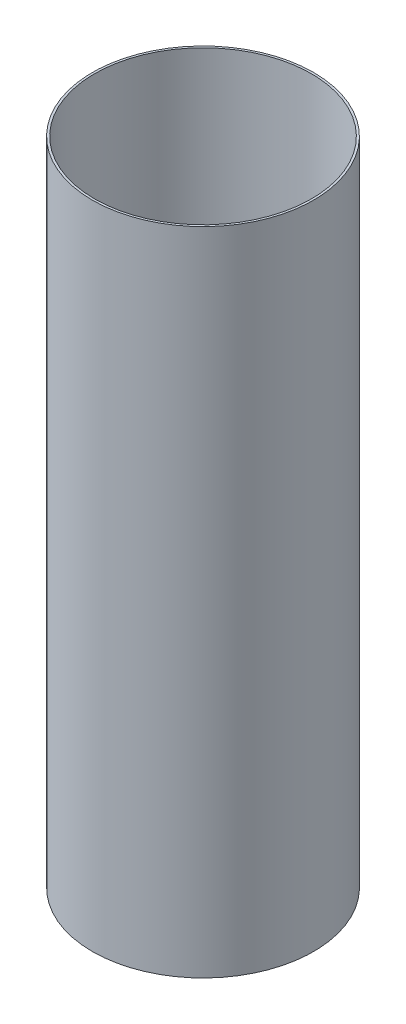
ISO-10303-21;
HEADER;
FILE_DESCRIPTION(('STEP AP214'),'2;1');
FILE_NAME('part.step','',(''),(''),'','','');
FILE_SCHEMA(('AUTOMOTIVE_DESIGN { 1 0 10303 214 1 1 1 1 }'));
ENDSEC;
DATA;
#1=APPLICATION_CONTEXT('core data for automotive mechanical design processes');
#2=APPLICATION_PROTOCOL_DEFINITION('international standard','automotive_design',2000,#1);
#3=PRODUCT_CONTEXT('',#1,'mechanical');
#4=PRODUCT('Part','Part','',(#3));
#5=PRODUCT_RELATED_PRODUCT_CATEGORY('part','',(#4));
#6=PRODUCT_DEFINITION_FORMATION('','',#4);
#7=PRODUCT_DEFINITION_CONTEXT('part definition',#1,'design');
#8=PRODUCT_DEFINITION('design','',#6,#7);
#9=PRODUCT_DEFINITION_SHAPE('','',#8);
#10=(LENGTH_UNIT() NAMED_UNIT(*) SI_UNIT(.MILLI.,.METRE.));
#11=(NAMED_UNIT(*) PLANE_ANGLE_UNIT() SI_UNIT($,.RADIAN.));
#12=(NAMED_UNIT(*) SI_UNIT($,.STERADIAN.) SOLID_ANGLE_UNIT());
#13=UNCERTAINTY_MEASURE_WITH_UNIT(LENGTH_MEASURE(1.E-05),#10,'distance_accuracy_value','');
#14=(GEOMETRIC_REPRESENTATION_CONTEXT(3) GLOBAL_UNCERTAINTY_ASSIGNED_CONTEXT((#13)) GLOBAL_UNIT_ASSIGNED_CONTEXT((#10,
#11,#12)) REPRESENTATION_CONTEXT('',''));
#15=CARTESIAN_POINT('',(0.,0.,0.));
#16=DIRECTION('',(0.,0.,1.));
#17=DIRECTION('',(1.,0.,0.));
#18=AXIS2_PLACEMENT_3D('',#15,#16,#17);
#19=CARTESIAN_POINT('',(0.,300.,0.));
#20=DIRECTION('',(0.,1.,0.));
#21=DIRECTION('',(0.,0.,1.));
#22=AXIS2_PLACEMENT_3D('',#19,#20,#21);
#23=PLANE('',#22);
#24=CARTESIAN_POINT('',(0.,300.,0.));
#25=DIRECTION('',(0.,1.,0.));
#26=DIRECTION('',(0.,0.,1.));
#27=AXIS2_PLACEMENT_3D('',#24,#25,#26);
#28=CIRCLE('',#27,51.);
#29=CARTESIAN_POINT('',(0.,300.,51.));
#30=VERTEX_POINT('',#29);
#31=EDGE_CURVE('E10',#30,#30,#28,.T.);
#32=ORIENTED_EDGE('',*,*,#31,.T.);
#33=EDGE_LOOP('',(#32));
#34=FACE_BOUND('',#33,.T.);
#35=CARTESIAN_POINT('',(0.,300.,0.));
#36=DIRECTION('',(0.,1.,0.));
#37=DIRECTION('',(0.,0.,1.));
#38=AXIS2_PLACEMENT_3D('',#35,#36,#37);
#39=CIRCLE('',#38,50.);
#40=CARTESIAN_POINT('',(0.,300.,50.));
#41=VERTEX_POINT('',#40);
#42=EDGE_CURVE('E45',#41,#41,#39,.T.);
#43=ORIENTED_EDGE('',*,*,#42,.F.);
#44=EDGE_LOOP('',(#43));
#45=FACE_BOUND('',#44,.T.);
#46=ADVANCED_FACE('F34',(#34,#45),#23,.T.);
#47=CARTESIAN_POINT('',(0.,0.,0.));
#48=DIRECTION('',(0.,1.,0.));
#49=DIRECTION('',(0.,0.,1.));
#50=AXIS2_PLACEMENT_3D('',#47,#48,#49);
#51=PLANE('',#50);
#52=CARTESIAN_POINT('',(0.,0.,0.));
#53=DIRECTION('',(0.,1.,0.));
#54=DIRECTION('',(0.,0.,1.));
#55=AXIS2_PLACEMENT_3D('',#52,#53,#54);
#56=CIRCLE('',#55,51.);
#57=CARTESIAN_POINT('',(0.,0.,51.));
#58=VERTEX_POINT('',#57);
#59=EDGE_CURVE('E38',#58,#58,#56,.T.);
#60=ORIENTED_EDGE('',*,*,#59,.F.);
#61=EDGE_LOOP('',(#60));
#62=FACE_BOUND('',#61,.T.);
#63=CARTESIAN_POINT('',(0.,0.,0.));
#64=DIRECTION('',(0.,1.,0.));
#65=DIRECTION('',(0.,0.,1.));
#66=AXIS2_PLACEMENT_3D('',#63,#64,#65);
#67=CIRCLE('',#66,50.);
#68=CARTESIAN_POINT('',(0.,0.,50.));
#69=VERTEX_POINT('',#68);
#70=EDGE_CURVE('E47',#69,#69,#67,.T.);
#71=ORIENTED_EDGE('',*,*,#70,.T.);
#72=EDGE_LOOP('',(#71));
#73=FACE_BOUND('',#72,.T.);
#74=ADVANCED_FACE('F57',(#62,#73),#51,.F.);
#75=CARTESIAN_POINT('',(0.,300.,0.));
#76=DIRECTION('',(0.,-1.,0.));
#77=DIRECTION('',(0.,0.,-1.));
#78=AXIS2_PLACEMENT_3D('',#75,#76,#77);
#79=CYLINDRICAL_SURFACE('',#78,51.);
#80=ORIENTED_EDGE('',*,*,#31,.F.);
#81=EDGE_LOOP('',(#80));
#82=FACE_BOUND('',#81,.T.);
#83=ORIENTED_EDGE('',*,*,#59,.T.);
#84=EDGE_LOOP('',(#83));
#85=FACE_BOUND('',#84,.T.);
#86=ADVANCED_FACE('F36',(#82,#85),#79,.T.);
#87=CARTESIAN_POINT('',(0.,300.,0.));
#88=DIRECTION('',(0.,-1.,0.));
#89=DIRECTION('',(0.,0.,-1.));
#90=AXIS2_PLACEMENT_3D('',#87,#88,#89);
#91=CYLINDRICAL_SURFACE('',#90,50.);
#92=ORIENTED_EDGE('',*,*,#42,.T.);
#93=EDGE_LOOP('',(#92));
#94=FACE_BOUND('',#93,.T.);
#95=ORIENTED_EDGE('',*,*,#70,.F.);
#96=EDGE_LOOP('',(#95));
#97=FACE_BOUND('',#96,.T.);
#98=ADVANCED_FACE('F53',(#94,#97),#91,.F.);
#99=CLOSED_SHELL('',(#46,#74,#86,#98));
#100=MANIFOLD_SOLID_BREP('B2',#99);
#101=ADVANCED_BREP_SHAPE_REPRESENTATION('',(#18,#100),#14);
#102=SHAPE_DEFINITION_REPRESENTATION(#9,#101);
ENDSEC;
END-ISO-10303-21;
